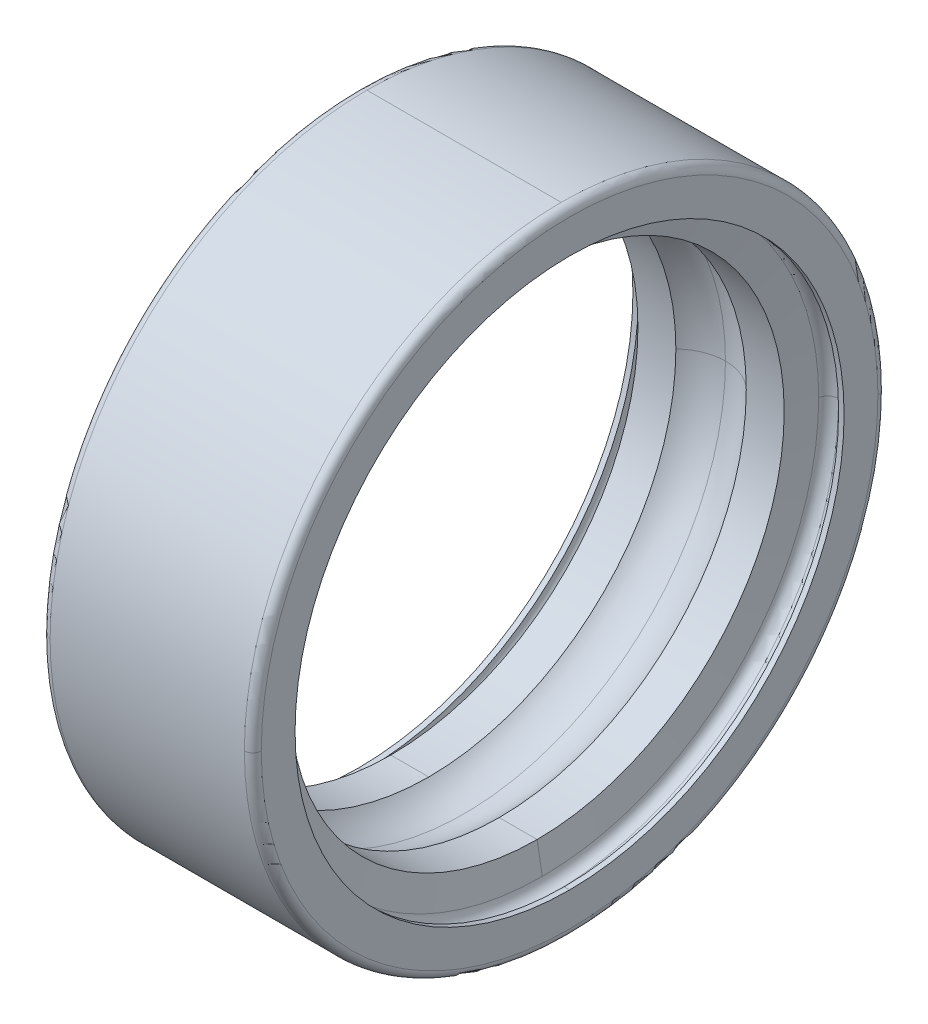
ISO-10303-21;
HEADER;
FILE_DESCRIPTION(('STEP AP214'),'2;1');
FILE_NAME('part.step','',(''),(''),'','','');
FILE_SCHEMA(('AUTOMOTIVE_DESIGN { 1 0 10303 214 1 1 1 1 }'));
ENDSEC;
DATA;
#1=APPLICATION_CONTEXT('core data for automotive mechanical design processes');
#2=APPLICATION_PROTOCOL_DEFINITION('international standard','automotive_design',2000,#1);
#3=PRODUCT_CONTEXT('',#1,'mechanical');
#4=PRODUCT('Part','Part','',(#3));
#5=PRODUCT_RELATED_PRODUCT_CATEGORY('part','',(#4));
#6=PRODUCT_DEFINITION_FORMATION('','',#4);
#7=PRODUCT_DEFINITION_CONTEXT('part definition',#1,'design');
#8=PRODUCT_DEFINITION('design','',#6,#7);
#9=PRODUCT_DEFINITION_SHAPE('','',#8);
#10=(LENGTH_UNIT() NAMED_UNIT(*) SI_UNIT(.MILLI.,.METRE.));
#11=(NAMED_UNIT(*) PLANE_ANGLE_UNIT() SI_UNIT($,.RADIAN.));
#12=(NAMED_UNIT(*) SI_UNIT($,.STERADIAN.) SOLID_ANGLE_UNIT());
#13=UNCERTAINTY_MEASURE_WITH_UNIT(LENGTH_MEASURE(1.E-05),#10,'distance_accuracy_value','');
#14=(GEOMETRIC_REPRESENTATION_CONTEXT(3) GLOBAL_UNCERTAINTY_ASSIGNED_CONTEXT((#13)) GLOBAL_UNIT_ASSIGNED_CONTEXT((#10,
#11,#12)) REPRESENTATION_CONTEXT('',''));
#15=CARTESIAN_POINT('',(0.,0.,0.));
#16=DIRECTION('',(0.,0.,1.));
#17=DIRECTION('',(1.,0.,0.));
#18=AXIS2_PLACEMENT_3D('',#15,#16,#17);
#19=CARTESIAN_POINT('',(4.61,0.,0.));
#20=DIRECTION('',(1.,0.,0.));
#21=DIRECTION('',(0.,0.,-1.));
#22=AXIS2_PLACEMENT_3D('',#19,#20,#21);
#23=TOROIDAL_SURFACE('',#22,6.5,0.26);
#24=CARTESIAN_POINT('',(4.61,0.,0.));
#25=DIRECTION('',(1.,0.,0.));
#26=DIRECTION('',(0.,0.,1.));
#27=AXIS2_PLACEMENT_3D('',#24,#25,#26);
#28=CIRCLE('',#27,6.76);
#29=CARTESIAN_POINT('',(4.61,0.,-6.76));
#30=VERTEX_POINT('',#29);
#31=CARTESIAN_POINT('',(4.61,0.,6.76));
#32=VERTEX_POINT('',#31);
#33=EDGE_CURVE('E184',#30,#32,#28,.T.);
#34=ORIENTED_EDGE('',*,*,#33,.T.);
#35=CARTESIAN_POINT('',(4.61,0.,6.5));
#36=DIRECTION('',(0.,-1.,0.));
#37=DIRECTION('',(0.,0.,1.));
#38=AXIS2_PLACEMENT_3D('',#35,#36,#37);
#39=CIRCLE('',#38,0.26);
#40=CARTESIAN_POINT('',(4.35394998421683,0.,6.5451485261934));
#41=VERTEX_POINT('',#40);
#42=EDGE_CURVE('E197',#32,#41,#39,.T.);
#43=ORIENTED_EDGE('',*,*,#42,.T.);
#44=CARTESIAN_POINT('',(4.35394998421683,0.,0.));
#45=DIRECTION('',(1.,0.,0.));
#46=DIRECTION('',(0.,1.,0.));
#47=AXIS2_PLACEMENT_3D('',#44,#45,#46);
#48=CIRCLE('',#47,6.5451485261934);
#49=CARTESIAN_POINT('',(4.35394998421683,6.5451485261934,0.));
#50=VERTEX_POINT('',#49);
#51=EDGE_CURVE('E31',#50,#41,#48,.T.);
#52=ORIENTED_EDGE('',*,*,#51,.F.);
#53=CARTESIAN_POINT('',(4.35394998421683,0.,0.));
#54=DIRECTION('',(1.,0.,0.));
#55=DIRECTION('',(0.,1.,0.));
#56=AXIS2_PLACEMENT_3D('',#53,#54,#55);
#57=CIRCLE('',#56,6.5451485261934);
#58=CARTESIAN_POINT('',(4.35394998421683,0.,-6.5451485261934));
#59=VERTEX_POINT('',#58);
#60=EDGE_CURVE('E185',#59,#50,#57,.T.);
#61=ORIENTED_EDGE('',*,*,#60,.F.);
#62=CARTESIAN_POINT('',(4.61,0.,-6.5));
#63=DIRECTION('',(0.,-1.,0.));
#64=DIRECTION('',(0.,0.,-1.));
#65=AXIS2_PLACEMENT_3D('',#62,#63,#64);
#66=CIRCLE('',#65,0.26);
#67=EDGE_CURVE('E181',#59,#30,#66,.T.);
#68=ORIENTED_EDGE('',*,*,#67,.T.);
#69=EDGE_LOOP('',(#34,#43,#52,#61,#68));
#70=FACE_BOUND('',#69,.T.);
#71=ADVANCED_FACE('F16',(#70),#23,.F.);
#72=CARTESIAN_POINT('',(4.935,0.,0.));
#73=DIRECTION('',(1.,0.,0.));
#74=DIRECTION('',(0.,1.,0.));
#75=AXIS2_PLACEMENT_3D('',#72,#73,#74);
#76=CYLINDRICAL_SURFACE('',#75,6.5);
#77=DIRECTION('',(1.,0.,0.));
#78=VECTOR('',#77,1.);
#79=CARTESIAN_POINT('',(4.935,6.5,0.));
#80=LINE('',#79,#78);
#81=CARTESIAN_POINT('',(4.87,6.5,0.));
#82=VERTEX_POINT('',#81);
#83=CARTESIAN_POINT('',(5.,6.5,0.));
#84=VERTEX_POINT('',#83);
#85=EDGE_CURVE('E323',#82,#84,#80,.T.);
#86=ORIENTED_EDGE('',*,*,#85,.T.);
#87=CARTESIAN_POINT('',(5.,0.,0.));
#88=DIRECTION('',(1.,0.,0.));
#89=DIRECTION('',(0.,1.,0.));
#90=AXIS2_PLACEMENT_3D('',#87,#88,#89);
#91=CIRCLE('',#90,6.5);
#92=CARTESIAN_POINT('',(5.,-6.5,0.));
#93=VERTEX_POINT('',#92);
#94=EDGE_CURVE('E11',#84,#93,#91,.T.);
#95=ORIENTED_EDGE('',*,*,#94,.T.);
#96=DIRECTION('',(-1.,0.,0.));
#97=VECTOR('',#96,1.);
#98=CARTESIAN_POINT('',(4.935,-6.5,0.));
#99=LINE('',#98,#97);
#100=CARTESIAN_POINT('',(4.87,-6.5,0.));
#101=VERTEX_POINT('',#100);
#102=EDGE_CURVE('E331',#93,#101,#99,.T.);
#103=ORIENTED_EDGE('',*,*,#102,.T.);
#104=CARTESIAN_POINT('',(4.87,0.,0.));
#105=DIRECTION('',(1.,0.,0.));
#106=DIRECTION('',(0.,1.,0.));
#107=AXIS2_PLACEMENT_3D('',#104,#105,#106);
#108=CIRCLE('',#107,6.5);
#109=CARTESIAN_POINT('',(4.87,0.,6.5));
#110=VERTEX_POINT('',#109);
#111=EDGE_CURVE('E201',#110,#101,#108,.T.);
#112=ORIENTED_EDGE('',*,*,#111,.F.);
#113=CARTESIAN_POINT('',(4.87,0.,0.));
#114=DIRECTION('',(1.,0.,0.));
#115=DIRECTION('',(0.,1.,0.));
#116=AXIS2_PLACEMENT_3D('',#113,#114,#115);
#117=CIRCLE('',#116,6.5);
#118=EDGE_CURVE('E241',#82,#110,#117,.T.);
#119=ORIENTED_EDGE('',*,*,#118,.F.);
#120=EDGE_LOOP('',(#86,#95,#103,#112,#119));
#121=FACE_BOUND('',#120,.T.);
#122=ADVANCED_FACE('F18',(#121),#76,.F.);
#123=CARTESIAN_POINT('',(5.,6.9,0.));
#124=DIRECTION('',(1.,0.,0.));
#125=DIRECTION('',(0.,1.,0.));
#126=AXIS2_PLACEMENT_3D('',#123,#124,#125);
#127=PLANE('',#126);
#128=ORIENTED_EDGE('',*,*,#94,.F.);
#129=CARTESIAN_POINT('',(5.,0.,0.));
#130=DIRECTION('',(1.,0.,0.));
#131=DIRECTION('',(0.,1.,0.));
#132=AXIS2_PLACEMENT_3D('',#129,#130,#131);
#133=CIRCLE('',#132,6.5);
#134=EDGE_CURVE('E337',#93,#84,#133,.T.);
#135=ORIENTED_EDGE('',*,*,#134,.F.);
#136=EDGE_LOOP('',(#128,#135));
#137=FACE_BOUND('',#136,.T.);
#138=CARTESIAN_POINT('',(5.,0.,0.));
#139=DIRECTION('',(1.,0.,0.));
#140=DIRECTION('',(0.,1.,0.));
#141=AXIS2_PLACEMENT_3D('',#138,#139,#140);
#142=CIRCLE('',#141,7.3);
#143=CARTESIAN_POINT('',(5.,0.,7.3));
#144=VERTEX_POINT('',#143);
#145=CARTESIAN_POINT('',(5.,0.,-7.3));
#146=VERTEX_POINT('',#145);
#147=EDGE_CURVE('E24',#144,#146,#142,.T.);
#148=ORIENTED_EDGE('',*,*,#147,.T.);
#149=CARTESIAN_POINT('',(5.,0.,0.));
#150=DIRECTION('',(1.,0.,0.));
#151=DIRECTION('',(0.,1.,0.));
#152=AXIS2_PLACEMENT_3D('',#149,#150,#151);
#153=CIRCLE('',#152,7.3);
#154=EDGE_CURVE('E246',#146,#144,#153,.T.);
#155=ORIENTED_EDGE('',*,*,#154,.T.);
#156=EDGE_LOOP('',(#148,#155));
#157=FACE_BOUND('',#156,.T.);
#158=ADVANCED_FACE('F401',(#137,#157),#127,.T.);
#159=CARTESIAN_POINT('',(4.8,0.,0.));
#160=DIRECTION('',(1.,0.,0.));
#161=DIRECTION('',(0.,0.,-1.));
#162=AXIS2_PLACEMENT_3D('',#159,#160,#161);
#163=TOROIDAL_SURFACE('',#162,7.3,0.2);
#164=CARTESIAN_POINT('',(4.8,0.,-7.3));
#165=DIRECTION('',(0.,-1.,0.));
#166=DIRECTION('',(0.,0.,-1.));
#167=AXIS2_PLACEMENT_3D('',#164,#165,#166);
#168=CIRCLE('',#167,0.2);
#169=CARTESIAN_POINT('',(4.8,0.,-7.5));
#170=VERTEX_POINT('',#169);
#171=EDGE_CURVE('E340',#170,#146,#168,.T.);
#172=ORIENTED_EDGE('',*,*,#171,.T.);
#173=ORIENTED_EDGE('',*,*,#147,.F.);
#174=CARTESIAN_POINT('',(4.8,0.,7.3));
#175=DIRECTION('',(0.,-1.,0.));
#176=DIRECTION('',(0.,0.,1.));
#177=AXIS2_PLACEMENT_3D('',#174,#175,#176);
#178=CIRCLE('',#177,0.2);
#179=CARTESIAN_POINT('',(4.8,0.,7.5));
#180=VERTEX_POINT('',#179);
#181=EDGE_CURVE('E253',#144,#180,#178,.T.);
#182=ORIENTED_EDGE('',*,*,#181,.T.);
#183=CARTESIAN_POINT('',(4.8,0.,0.));
#184=DIRECTION('',(1.,0.,0.));
#185=DIRECTION('',(0.,1.,0.));
#186=AXIS2_PLACEMENT_3D('',#183,#184,#185);
#187=CIRCLE('',#186,7.5);
#188=CARTESIAN_POINT('',(4.8,-7.5,0.));
#189=VERTEX_POINT('',#188);
#190=EDGE_CURVE('E303',#180,#189,#187,.T.);
#191=ORIENTED_EDGE('',*,*,#190,.T.);
#192=CARTESIAN_POINT('',(4.8,0.,0.));
#193=DIRECTION('',(1.,0.,0.));
#194=DIRECTION('',(0.,1.,0.));
#195=AXIS2_PLACEMENT_3D('',#192,#193,#194);
#196=CIRCLE('',#195,7.5);
#197=EDGE_CURVE('E398',#189,#170,#196,.T.);
#198=ORIENTED_EDGE('',*,*,#197,.T.);
#199=EDGE_LOOP('',(#172,#173,#182,#191,#198));
#200=FACE_BOUND('',#199,.T.);
#201=ADVANCED_FACE('F407',(#200),#163,.T.);
#202=CARTESIAN_POINT('',(2.5,0.,0.));
#203=DIRECTION('',(1.,0.,0.));
#204=DIRECTION('',(0.,1.,0.));
#205=AXIS2_PLACEMENT_3D('',#202,#203,#204);
#206=CYLINDRICAL_SURFACE('',#205,7.5);
#207=DIRECTION('',(1.,0.,0.));
#208=VECTOR('',#207,1.);
#209=CARTESIAN_POINT('',(2.5,7.5,0.));
#210=LINE('',#209,#208);
#211=CARTESIAN_POINT('',(0.2,7.5,0.));
#212=VERTEX_POINT('',#211);
#213=CARTESIAN_POINT('',(4.8,7.5,0.));
#214=VERTEX_POINT('',#213);
#215=EDGE_CURVE('E239',#212,#214,#210,.T.);
#216=ORIENTED_EDGE('',*,*,#215,.T.);
#217=CARTESIAN_POINT('',(4.8,0.,0.));
#218=DIRECTION('',(1.,0.,0.));
#219=DIRECTION('',(0.,1.,0.));
#220=AXIS2_PLACEMENT_3D('',#217,#218,#219);
#221=CIRCLE('',#220,7.5);
#222=EDGE_CURVE('E343',#170,#214,#221,.T.);
#223=ORIENTED_EDGE('',*,*,#222,.F.);
#224=ORIENTED_EDGE('',*,*,#197,.F.);
#225=DIRECTION('',(-1.,0.,0.));
#226=VECTOR('',#225,1.);
#227=CARTESIAN_POINT('',(2.5,-7.5,0.));
#228=LINE('',#227,#226);
#229=CARTESIAN_POINT('',(0.2,-7.5,0.));
#230=VERTEX_POINT('',#229);
#231=EDGE_CURVE('E283',#189,#230,#228,.T.);
#232=ORIENTED_EDGE('',*,*,#231,.T.);
#233=CARTESIAN_POINT('',(0.2,0.,0.));
#234=DIRECTION('',(1.,0.,0.));
#235=DIRECTION('',(0.,1.,0.));
#236=AXIS2_PLACEMENT_3D('',#233,#234,#235);
#237=CIRCLE('',#236,7.5);
#238=CARTESIAN_POINT('',(0.2,0.,-7.5));
#239=VERTEX_POINT('',#238);
#240=EDGE_CURVE('E366',#230,#239,#237,.T.);
#241=ORIENTED_EDGE('',*,*,#240,.T.);
#242=CARTESIAN_POINT('',(0.2,0.,0.));
#243=DIRECTION('',(1.,0.,0.));
#244=DIRECTION('',(0.,1.,0.));
#245=AXIS2_PLACEMENT_3D('',#242,#243,#244);
#246=CIRCLE('',#245,7.5);
#247=EDGE_CURVE('E327',#239,#212,#246,.T.);
#248=ORIENTED_EDGE('',*,*,#247,.T.);
#249=EDGE_LOOP('',(#216,#223,#224,#232,#241,#248));
#250=FACE_BOUND('',#249,.T.);
#251=ADVANCED_FACE('F411',(#250),#206,.T.);
#252=CARTESIAN_POINT('',(0.2,0.,0.));
#253=DIRECTION('',(1.,0.,0.));
#254=DIRECTION('',(0.,0.,-1.));
#255=AXIS2_PLACEMENT_3D('',#252,#253,#254);
#256=TOROIDAL_SURFACE('',#255,7.3,0.2);
#257=CARTESIAN_POINT('',(0.2,0.,-7.3));
#258=DIRECTION('',(0.,-1.,0.));
#259=DIRECTION('',(0.,0.,-1.));
#260=AXIS2_PLACEMENT_3D('',#257,#258,#259);
#261=CIRCLE('',#260,0.2);
#262=CARTESIAN_POINT('',(0.,0.,-7.3));
#263=VERTEX_POINT('',#262);
#264=EDGE_CURVE('E220',#263,#239,#261,.T.);
#265=ORIENTED_EDGE('',*,*,#264,.T.);
#266=ORIENTED_EDGE('',*,*,#240,.F.);
#267=CARTESIAN_POINT('',(0.2,0.,0.));
#268=DIRECTION('',(1.,0.,0.));
#269=DIRECTION('',(0.,1.,0.));
#270=AXIS2_PLACEMENT_3D('',#267,#268,#269);
#271=CIRCLE('',#270,7.5);
#272=CARTESIAN_POINT('',(0.2,0.,7.5));
#273=VERTEX_POINT('',#272);
#274=EDGE_CURVE('E238',#273,#230,#271,.T.);
#275=ORIENTED_EDGE('',*,*,#274,.F.);
#276=CARTESIAN_POINT('',(0.2,0.,7.3));
#277=DIRECTION('',(0.,-1.,0.));
#278=DIRECTION('',(0.,0.,1.));
#279=AXIS2_PLACEMENT_3D('',#276,#277,#278);
#280=CIRCLE('',#279,0.2);
#281=CARTESIAN_POINT('',(0.,0.,7.3));
#282=VERTEX_POINT('',#281);
#283=EDGE_CURVE('E324',#273,#282,#280,.T.);
#284=ORIENTED_EDGE('',*,*,#283,.T.);
#285=CARTESIAN_POINT('',(0.,0.,0.));
#286=DIRECTION('',(1.,0.,0.));
#287=DIRECTION('',(0.,1.,0.));
#288=AXIS2_PLACEMENT_3D('',#285,#286,#287);
#289=CIRCLE('',#288,7.3);
#290=EDGE_CURVE('E361',#282,#263,#289,.T.);
#291=ORIENTED_EDGE('',*,*,#290,.T.);
#292=EDGE_LOOP('',(#265,#266,#275,#284,#291));
#293=FACE_BOUND('',#292,.T.);
#294=ADVANCED_FACE('F424',(#293),#256,.T.);
#295=CARTESIAN_POINT('',(0.,6.9,0.));
#296=DIRECTION('',(-1.,0.,0.));
#297=DIRECTION('',(0.,0.,1.));
#298=AXIS2_PLACEMENT_3D('',#295,#296,#297);
#299=PLANE('',#298);
#300=CARTESIAN_POINT('',(0.,0.,0.));
#301=DIRECTION('',(1.,0.,0.));
#302=DIRECTION('',(0.,1.,0.));
#303=AXIS2_PLACEMENT_3D('',#300,#301,#302);
#304=CIRCLE('',#303,6.5);
#305=CARTESIAN_POINT('',(0.,6.5,0.));
#306=VERTEX_POINT('',#305);
#307=CARTESIAN_POINT('',(0.,-6.5,0.));
#308=VERTEX_POINT('',#307);
#309=EDGE_CURVE('E357',#306,#308,#304,.T.);
#310=ORIENTED_EDGE('',*,*,#309,.T.);
#311=CARTESIAN_POINT('',(0.,0.,0.));
#312=DIRECTION('',(1.,0.,0.));
#313=DIRECTION('',(0.,1.,0.));
#314=AXIS2_PLACEMENT_3D('',#311,#312,#313);
#315=CIRCLE('',#314,6.5);
#316=EDGE_CURVE('E364',#308,#306,#315,.T.);
#317=ORIENTED_EDGE('',*,*,#316,.T.);
#318=EDGE_LOOP('',(#310,#317));
#319=FACE_BOUND('',#318,.T.);
#320=CARTESIAN_POINT('',(0.,0.,0.));
#321=DIRECTION('',(1.,0.,0.));
#322=DIRECTION('',(0.,1.,0.));
#323=AXIS2_PLACEMENT_3D('',#320,#321,#322);
#324=CIRCLE('',#323,7.3);
#325=EDGE_CURVE('E328',#263,#282,#324,.T.);
#326=ORIENTED_EDGE('',*,*,#325,.F.);
#327=ORIENTED_EDGE('',*,*,#290,.F.);
#328=EDGE_LOOP('',(#326,#327));
#329=FACE_BOUND('',#328,.T.);
#330=ADVANCED_FACE('F427',(#319,#329),#299,.T.);
#331=CARTESIAN_POINT('',(0.065,0.,0.));
#332=DIRECTION('',(1.,0.,0.));
#333=DIRECTION('',(0.,1.,0.));
#334=AXIS2_PLACEMENT_3D('',#331,#332,#333);
#335=CYLINDRICAL_SURFACE('',#334,6.5);
#336=DIRECTION('',(1.,0.,0.));
#337=VECTOR('',#336,1.);
#338=CARTESIAN_POINT('',(0.065,6.5,0.));
#339=LINE('',#338,#337);
#340=CARTESIAN_POINT('',(0.13,6.5,0.));
#341=VERTEX_POINT('',#340);
#342=EDGE_CURVE('E359',#306,#341,#339,.T.);
#343=ORIENTED_EDGE('',*,*,#342,.T.);
#344=CARTESIAN_POINT('',(0.13,0.,0.));
#345=DIRECTION('',(1.,0.,0.));
#346=DIRECTION('',(0.,1.,0.));
#347=AXIS2_PLACEMENT_3D('',#344,#345,#346);
#348=CIRCLE('',#347,6.5);
#349=CARTESIAN_POINT('',(0.13,0.,6.5));
#350=VERTEX_POINT('',#349);
#351=EDGE_CURVE('E352',#341,#350,#348,.T.);
#352=ORIENTED_EDGE('',*,*,#351,.T.);
#353=CARTESIAN_POINT('',(0.13,0.,0.));
#354=DIRECTION('',(1.,0.,0.));
#355=DIRECTION('',(0.,1.,0.));
#356=AXIS2_PLACEMENT_3D('',#353,#354,#355);
#357=CIRCLE('',#356,6.5);
#358=CARTESIAN_POINT('',(0.13,-6.5,0.));
#359=VERTEX_POINT('',#358);
#360=EDGE_CURVE('E294',#350,#359,#357,.T.);
#361=ORIENTED_EDGE('',*,*,#360,.T.);
#362=DIRECTION('',(-1.,0.,0.));
#363=VECTOR('',#362,1.);
#364=CARTESIAN_POINT('',(0.065,-6.5,0.));
#365=LINE('',#364,#363);
#366=EDGE_CURVE('E301',#359,#308,#365,.T.);
#367=ORIENTED_EDGE('',*,*,#366,.T.);
#368=ORIENTED_EDGE('',*,*,#309,.F.);
#369=EDGE_LOOP('',(#343,#352,#361,#367,#368));
#370=FACE_BOUND('',#369,.T.);
#371=ADVANCED_FACE('F429',(#370),#335,.F.);
#372=CARTESIAN_POINT('',(0.39,0.,0.));
#373=DIRECTION('',(1.,0.,0.));
#374=DIRECTION('',(0.,0.,-1.));
#375=AXIS2_PLACEMENT_3D('',#372,#373,#374);
#376=TOROIDAL_SURFACE('',#375,6.5,0.26);
#377=CARTESIAN_POINT('',(0.39,0.,0.));
#378=DIRECTION('',(1.,0.,0.));
#379=DIRECTION('',(0.,0.,1.));
#380=AXIS2_PLACEMENT_3D('',#377,#378,#379);
#381=CIRCLE('',#380,6.76);
#382=CARTESIAN_POINT('',(0.39,0.,-6.76));
#383=VERTEX_POINT('',#382);
#384=CARTESIAN_POINT('',(0.39,0.,6.76));
#385=VERTEX_POINT('',#384);
#386=EDGE_CURVE('E252',#383,#385,#381,.T.);
#387=ORIENTED_EDGE('',*,*,#386,.T.);
#388=CARTESIAN_POINT('',(0.39,0.,6.5));
#389=DIRECTION('',(0.,-1.,0.));
#390=DIRECTION('',(0.,0.,1.));
#391=AXIS2_PLACEMENT_3D('',#388,#389,#390);
#392=CIRCLE('',#391,0.26);
#393=EDGE_CURVE('E230',#385,#350,#392,.T.);
#394=ORIENTED_EDGE('',*,*,#393,.T.);
#395=ORIENTED_EDGE('',*,*,#351,.F.);
#396=CARTESIAN_POINT('',(0.13,0.,0.));
#397=DIRECTION('',(1.,0.,0.));
#398=DIRECTION('',(0.,1.,0.));
#399=AXIS2_PLACEMENT_3D('',#396,#397,#398);
#400=CIRCLE('',#399,6.5);
#401=CARTESIAN_POINT('',(0.13,0.,-6.5));
#402=VERTEX_POINT('',#401);
#403=EDGE_CURVE('E295',#402,#341,#400,.T.);
#404=ORIENTED_EDGE('',*,*,#403,.F.);
#405=CARTESIAN_POINT('',(0.39,0.,-6.5));
#406=DIRECTION('',(0.,-1.,0.));
#407=DIRECTION('',(0.,0.,-1.));
#408=AXIS2_PLACEMENT_3D('',#405,#406,#407);
#409=CIRCLE('',#408,0.26);
#410=EDGE_CURVE('E292',#402,#383,#409,.T.);
#411=ORIENTED_EDGE('',*,*,#410,.T.);
#412=EDGE_LOOP('',(#387,#394,#395,#404,#411));
#413=FACE_BOUND('',#412,.T.);
#414=ADVANCED_FACE('F437',(#413),#376,.F.);
#415=CARTESIAN_POINT('',(0.707336736166986,0.,0.));
#416=DIRECTION('',(-1.,0.,0.));
#417=DIRECTION('',(0.,1.,0.));
#418=AXIS2_PLACEMENT_3D('',#415,#416,#417);
#419=CONICAL_SURFACE('',#418,6.1975742630967,1.39626340159546);
#420=DIRECTION('',(0.17364817766693,-0.984807753012208,0.));
#421=VECTOR('',#420,1.);
#422=CARTESIAN_POINT('',(0.707336736166986,6.1975742630967,0.));
#423=LINE('',#422,#421);
#424=CARTESIAN_POINT('',(0.646050015783175,6.5451485261934,0.));
#425=VERTEX_POINT('',#424);
#426=CARTESIAN_POINT('',(0.768623456550796,5.85,0.));
#427=VERTEX_POINT('',#426);
#428=EDGE_CURVE('E227',#425,#427,#423,.T.);
#429=ORIENTED_EDGE('',*,*,#428,.T.);
#430=CARTESIAN_POINT('',(0.768623456550796,0.,0.));
#431=DIRECTION('',(1.,0.,0.));
#432=DIRECTION('',(0.,1.,0.));
#433=AXIS2_PLACEMENT_3D('',#430,#431,#432);
#434=CIRCLE('',#433,5.85);
#435=CARTESIAN_POINT('',(0.768623456550796,-5.85,0.));
#436=VERTEX_POINT('',#435);
#437=EDGE_CURVE('E350',#427,#436,#434,.T.);
#438=ORIENTED_EDGE('',*,*,#437,.T.);
#439=DIRECTION('',(-0.17364817766693,-0.984807753012208,0.));
#440=VECTOR('',#439,1.);
#441=CARTESIAN_POINT('',(0.707336736166986,-6.1975742630967,0.));
#442=LINE('',#441,#440);
#443=CARTESIAN_POINT('',(0.646050015783175,-6.5451485261934,0.));
#444=VERTEX_POINT('',#443);
#445=EDGE_CURVE('E229',#436,#444,#442,.T.);
#446=ORIENTED_EDGE('',*,*,#445,.T.);
#447=CARTESIAN_POINT('',(0.646050015783175,0.,0.));
#448=DIRECTION('',(1.,0.,0.));
#449=DIRECTION('',(0.,1.,0.));
#450=AXIS2_PLACEMENT_3D('',#447,#448,#449);
#451=CIRCLE('',#450,6.5451485261934);
#452=CARTESIAN_POINT('',(0.646050015783175,0.,6.5451485261934));
#453=VERTEX_POINT('',#452);
#454=EDGE_CURVE('E291',#453,#444,#451,.T.);
#455=ORIENTED_EDGE('',*,*,#454,.F.);
#456=CARTESIAN_POINT('',(0.646050015783175,0.,0.));
#457=DIRECTION('',(1.,0.,0.));
#458=DIRECTION('',(0.,1.,0.));
#459=AXIS2_PLACEMENT_3D('',#456,#457,#458);
#460=CIRCLE('',#459,6.5451485261934);
#461=EDGE_CURVE('E265',#425,#453,#460,.T.);
#462=ORIENTED_EDGE('',*,*,#461,.F.);
#463=EDGE_LOOP('',(#429,#438,#446,#455,#462));
#464=FACE_BOUND('',#463,.T.);
#465=ADVANCED_FACE('F477',(#464),#419,.F.);
#466=CARTESIAN_POINT('',(1.21754133285365,0.,0.));
#467=DIRECTION('',(1.,0.,0.));
#468=DIRECTION('',(0.,1.,0.));
#469=AXIS2_PLACEMENT_3D('',#466,#467,#468);
#470=CYLINDRICAL_SURFACE('',#469,5.85);
#471=DIRECTION('',(1.,0.,0.));
#472=VECTOR('',#471,1.);
#473=CARTESIAN_POINT('',(1.21754133285365,5.85,0.));
#474=LINE('',#473,#472);
#475=CARTESIAN_POINT('',(1.6664592091565,5.85,0.));
#476=VERTEX_POINT('',#475);
#477=EDGE_CURVE('E275',#427,#476,#474,.T.);
#478=ORIENTED_EDGE('',*,*,#477,.T.);
#479=CARTESIAN_POINT('',(1.6664592091565,0.,0.));
#480=DIRECTION('',(1.,0.,0.));
#481=DIRECTION('',(0.,1.,0.));
#482=AXIS2_PLACEMENT_3D('',#479,#480,#481);
#483=CIRCLE('',#482,5.85);
#484=CARTESIAN_POINT('',(1.6664592091565,0.,5.85));
#485=VERTEX_POINT('',#484);
#486=EDGE_CURVE('E353',#476,#485,#483,.T.);
#487=ORIENTED_EDGE('',*,*,#486,.T.);
#488=CARTESIAN_POINT('',(1.6664592091565,0.,0.));
#489=DIRECTION('',(1.,0.,0.));
#490=DIRECTION('',(0.,1.,0.));
#491=AXIS2_PLACEMENT_3D('',#488,#489,#490);
#492=CIRCLE('',#491,5.85);
#493=CARTESIAN_POINT('',(1.6664592091565,-5.85,0.));
#494=VERTEX_POINT('',#493);
#495=EDGE_CURVE('E383',#485,#494,#492,.T.);
#496=ORIENTED_EDGE('',*,*,#495,.T.);
#497=DIRECTION('',(-1.,0.,0.));
#498=VECTOR('',#497,1.);
#499=CARTESIAN_POINT('',(1.21754133285365,-5.85,0.));
#500=LINE('',#499,#498);
#501=EDGE_CURVE('E271',#494,#436,#500,.T.);
#502=ORIENTED_EDGE('',*,*,#501,.T.);
#503=ORIENTED_EDGE('',*,*,#437,.F.);
#504=EDGE_LOOP('',(#478,#487,#496,#502,#503));
#505=FACE_BOUND('',#504,.T.);
#506=ADVANCED_FACE('F474',(#505),#470,.F.);
#507=CARTESIAN_POINT('',(2.5,0.,0.));
#508=DIRECTION('',(1.,0.,0.));
#509=DIRECTION('',(0.,0.,-1.));
#510=AXIS2_PLACEMENT_3D('',#507,#508,#509);
#511=TOROIDAL_SURFACE('',#510,5.,1.1905);
#512=CARTESIAN_POINT('',(2.5,0.,0.));
#513=DIRECTION('',(1.,0.,0.));
#514=DIRECTION('',(0.,0.,1.));
#515=AXIS2_PLACEMENT_3D('',#512,#513,#514);
#516=CIRCLE('',#515,6.1905);
#517=CARTESIAN_POINT('',(2.5,0.,-6.1905));
#518=VERTEX_POINT('',#517);
#519=CARTESIAN_POINT('',(2.5,0.,6.1905));
#520=VERTEX_POINT('',#519);
#521=EDGE_CURVE('E250',#518,#520,#516,.T.);
#522=ORIENTED_EDGE('',*,*,#521,.T.);
#523=CARTESIAN_POINT('',(2.5,0.,5.));
#524=DIRECTION('',(0.,-1.,0.));
#525=DIRECTION('',(0.,0.,1.));
#526=AXIS2_PLACEMENT_3D('',#523,#524,#525);
#527=CIRCLE('',#526,1.1905);
#528=EDGE_CURVE('E385',#520,#485,#527,.T.);
#529=ORIENTED_EDGE('',*,*,#528,.T.);
#530=ORIENTED_EDGE('',*,*,#486,.F.);
#531=CARTESIAN_POINT('',(1.6664592091565,0.,0.));
#532=DIRECTION('',(1.,0.,0.));
#533=DIRECTION('',(0.,1.,0.));
#534=AXIS2_PLACEMENT_3D('',#531,#532,#533);
#535=CIRCLE('',#534,5.85);
#536=CARTESIAN_POINT('',(1.6664592091565,0.,-5.85));
#537=VERTEX_POINT('',#536);
#538=EDGE_CURVE('E332',#537,#476,#535,.T.);
#539=ORIENTED_EDGE('',*,*,#538,.F.);
#540=CARTESIAN_POINT('',(2.5,0.,-5.));
#541=DIRECTION('',(0.,-1.,0.));
#542=DIRECTION('',(0.,0.,-1.));
#543=AXIS2_PLACEMENT_3D('',#540,#541,#542);
#544=CIRCLE('',#543,1.1905);
#545=EDGE_CURVE('E335',#537,#518,#544,.T.);
#546=ORIENTED_EDGE('',*,*,#545,.T.);
#547=EDGE_LOOP('',(#522,#529,#530,#539,#546));
#548=FACE_BOUND('',#547,.T.);
#549=ADVANCED_FACE('F473',(#548),#511,.F.);
#550=CARTESIAN_POINT('',(3.78245866714635,0.,0.));
#551=DIRECTION('',(1.,0.,0.));
#552=DIRECTION('',(0.,1.,0.));
#553=AXIS2_PLACEMENT_3D('',#550,#551,#552);
#554=CYLINDRICAL_SURFACE('',#553,5.85);
#555=DIRECTION('',(1.,0.,0.));
#556=VECTOR('',#555,1.);
#557=CARTESIAN_POINT('',(3.78245866714635,5.85,0.));
#558=LINE('',#557,#556);
#559=CARTESIAN_POINT('',(3.3335407908435,5.85,0.));
#560=VERTEX_POINT('',#559);
#561=CARTESIAN_POINT('',(4.2313765434492,5.85,0.));
#562=VERTEX_POINT('',#561);
#563=EDGE_CURVE('E388',#560,#562,#558,.T.);
#564=ORIENTED_EDGE('',*,*,#563,.T.);
#565=CARTESIAN_POINT('',(4.2313765434492,0.,0.));
#566=DIRECTION('',(1.,0.,0.));
#567=DIRECTION('',(0.,1.,0.));
#568=AXIS2_PLACEMENT_3D('',#565,#566,#567);
#569=CIRCLE('',#568,5.85);
#570=CARTESIAN_POINT('',(4.2313765434492,-5.85,0.));
#571=VERTEX_POINT('',#570);
#572=EDGE_CURVE('E39',#562,#571,#569,.T.);
#573=ORIENTED_EDGE('',*,*,#572,.T.);
#574=DIRECTION('',(-1.,0.,0.));
#575=VECTOR('',#574,1.);
#576=CARTESIAN_POINT('',(3.78245866714635,-5.85,0.));
#577=LINE('',#576,#575);
#578=CARTESIAN_POINT('',(3.3335407908435,-5.85,0.));
#579=VERTEX_POINT('',#578);
#580=EDGE_CURVE('E390',#571,#579,#577,.T.);
#581=ORIENTED_EDGE('',*,*,#580,.T.);
#582=CARTESIAN_POINT('',(3.3335407908435,0.,0.));
#583=DIRECTION('',(1.,0.,0.));
#584=DIRECTION('',(0.,1.,0.));
#585=AXIS2_PLACEMENT_3D('',#582,#583,#584);
#586=CIRCLE('',#585,5.85);
#587=CARTESIAN_POINT('',(3.3335407908435,0.,5.85));
#588=VERTEX_POINT('',#587);
#589=EDGE_CURVE('E280',#588,#579,#586,.T.);
#590=ORIENTED_EDGE('',*,*,#589,.F.);
#591=CARTESIAN_POINT('',(3.3335407908435,0.,0.));
#592=DIRECTION('',(1.,0.,0.));
#593=DIRECTION('',(0.,1.,0.));
#594=AXIS2_PLACEMENT_3D('',#591,#592,#593);
#595=CIRCLE('',#594,5.85);
#596=EDGE_CURVE('E225',#560,#588,#595,.T.);
#597=ORIENTED_EDGE('',*,*,#596,.F.);
#598=EDGE_LOOP('',(#564,#573,#581,#590,#597));
#599=FACE_BOUND('',#598,.T.);
#600=ADVANCED_FACE('F469',(#599),#554,.F.);
#601=CARTESIAN_POINT('',(4.29266326383302,0.,0.));
#602=DIRECTION('',(1.,0.,0.));
#603=DIRECTION('',(0.,1.,0.));
#604=AXIS2_PLACEMENT_3D('',#601,#602,#603);
#605=CONICAL_SURFACE('',#604,6.1975742630967,1.39626340159547);
#606=DIRECTION('',(0.173648177666929,0.984807753012208,0.));
#607=VECTOR('',#606,1.);
#608=CARTESIAN_POINT('',(4.29266326383302,6.1975742630967,0.));
#609=LINE('',#608,#607);
#610=EDGE_CURVE('E312',#562,#50,#609,.T.);
#611=ORIENTED_EDGE('',*,*,#610,.T.);
#612=ORIENTED_EDGE('',*,*,#51,.T.);
#613=CARTESIAN_POINT('',(4.35394998421683,0.,0.));
#614=DIRECTION('',(1.,0.,0.));
#615=DIRECTION('',(0.,1.,0.));
#616=AXIS2_PLACEMENT_3D('',#613,#614,#615);
#617=CIRCLE('',#616,6.5451485261934);
#618=CARTESIAN_POINT('',(4.35394998421683,-6.5451485261934,0.));
#619=VERTEX_POINT('',#618);
#620=EDGE_CURVE('E314',#41,#619,#617,.T.);
#621=ORIENTED_EDGE('',*,*,#620,.T.);
#622=DIRECTION('',(-0.173648177666929,0.984807753012208,0.));
#623=VECTOR('',#622,1.);
#624=CARTESIAN_POINT('',(4.29266326383302,-6.1975742630967,0.));
#625=LINE('',#624,#623);
#626=EDGE_CURVE('E310',#619,#571,#625,.T.);
#627=ORIENTED_EDGE('',*,*,#626,.T.);
#628=ORIENTED_EDGE('',*,*,#572,.F.);
#629=EDGE_LOOP('',(#611,#612,#621,#627,#628));
#630=FACE_BOUND('',#629,.T.);
#631=ADVANCED_FACE('F465',(#630),#605,.F.);
#632=CARTESIAN_POINT('',(4.29266326383302,0.,0.));
#633=DIRECTION('',(1.,0.,0.));
#634=DIRECTION('',(0.,1.,0.));
#635=AXIS2_PLACEMENT_3D('',#632,#633,#634);
#636=CONICAL_SURFACE('',#635,6.1975742630967,1.39626340159547);
#637=ORIENTED_EDGE('',*,*,#610,.F.);
#638=CARTESIAN_POINT('',(4.2313765434492,0.,0.));
#639=DIRECTION('',(1.,0.,0.));
#640=DIRECTION('',(0.,1.,0.));
#641=AXIS2_PLACEMENT_3D('',#638,#639,#640);
#642=CIRCLE('',#641,5.85);
#643=EDGE_CURVE('E317',#571,#562,#642,.T.);
#644=ORIENTED_EDGE('',*,*,#643,.F.);
#645=ORIENTED_EDGE('',*,*,#626,.F.);
#646=CARTESIAN_POINT('',(4.35394998421683,0.,0.));
#647=DIRECTION('',(1.,0.,0.));
#648=DIRECTION('',(0.,1.,0.));
#649=AXIS2_PLACEMENT_3D('',#646,#647,#648);
#650=CIRCLE('',#649,6.5451485261934);
#651=EDGE_CURVE('E189',#619,#59,#650,.T.);
#652=ORIENTED_EDGE('',*,*,#651,.T.);
#653=ORIENTED_EDGE('',*,*,#60,.T.);
#654=EDGE_LOOP('',(#637,#644,#645,#652,#653));
#655=FACE_BOUND('',#654,.T.);
#656=ADVANCED_FACE('F461',(#655),#636,.F.);
#657=CARTESIAN_POINT('',(3.78245866714635,0.,0.));
#658=DIRECTION('',(1.,0.,0.));
#659=DIRECTION('',(0.,1.,0.));
#660=AXIS2_PLACEMENT_3D('',#657,#658,#659);
#661=CYLINDRICAL_SURFACE('',#660,5.85);
#662=ORIENTED_EDGE('',*,*,#563,.F.);
#663=CARTESIAN_POINT('',(3.3335407908435,0.,0.));
#664=DIRECTION('',(1.,0.,0.));
#665=DIRECTION('',(0.,1.,0.));
#666=AXIS2_PLACEMENT_3D('',#663,#664,#665);
#667=CIRCLE('',#666,5.85);
#668=CARTESIAN_POINT('',(3.3335407908435,0.,-5.85));
#669=VERTEX_POINT('',#668);
#670=EDGE_CURVE('E222',#669,#560,#667,.T.);
#671=ORIENTED_EDGE('',*,*,#670,.F.);
#672=CARTESIAN_POINT('',(3.3335407908435,0.,0.));
#673=DIRECTION('',(1.,0.,0.));
#674=DIRECTION('',(0.,1.,0.));
#675=AXIS2_PLACEMENT_3D('',#672,#673,#674);
#676=CIRCLE('',#675,5.85);
#677=EDGE_CURVE('E286',#579,#669,#676,.T.);
#678=ORIENTED_EDGE('',*,*,#677,.F.);
#679=ORIENTED_EDGE('',*,*,#580,.F.);
#680=ORIENTED_EDGE('',*,*,#643,.T.);
#681=EDGE_LOOP('',(#662,#671,#678,#679,#680));
#682=FACE_BOUND('',#681,.T.);
#683=ADVANCED_FACE('F457',(#682),#661,.F.);
#684=CARTESIAN_POINT('',(2.5,0.,0.));
#685=DIRECTION('',(1.,0.,0.));
#686=DIRECTION('',(0.,0.,-1.));
#687=AXIS2_PLACEMENT_3D('',#684,#685,#686);
#688=TOROIDAL_SURFACE('',#687,5.,1.1905);
#689=CARTESIAN_POINT('',(2.5,0.,0.));
#690=DIRECTION('',(1.,0.,0.));
#691=DIRECTION('',(0.,0.,1.));
#692=AXIS2_PLACEMENT_3D('',#689,#690,#691);
#693=CIRCLE('',#692,6.1905);
#694=EDGE_CURVE('E244',#520,#518,#693,.T.);
#695=ORIENTED_EDGE('',*,*,#694,.T.);
#696=ORIENTED_EDGE('',*,*,#545,.F.);
#697=CARTESIAN_POINT('',(1.6664592091565,0.,0.));
#698=DIRECTION('',(1.,0.,0.));
#699=DIRECTION('',(0.,1.,0.));
#700=AXIS2_PLACEMENT_3D('',#697,#698,#699);
#701=CIRCLE('',#700,5.85);
#702=EDGE_CURVE('E274',#494,#537,#701,.T.);
#703=ORIENTED_EDGE('',*,*,#702,.F.);
#704=ORIENTED_EDGE('',*,*,#495,.F.);
#705=ORIENTED_EDGE('',*,*,#528,.F.);
#706=EDGE_LOOP('',(#695,#696,#703,#704,#705));
#707=FACE_BOUND('',#706,.T.);
#708=ADVANCED_FACE('F460',(#707),#688,.F.);
#709=CARTESIAN_POINT('',(1.21754133285365,0.,0.));
#710=DIRECTION('',(1.,0.,0.));
#711=DIRECTION('',(0.,1.,0.));
#712=AXIS2_PLACEMENT_3D('',#709,#710,#711);
#713=CYLINDRICAL_SURFACE('',#712,5.85);
#714=ORIENTED_EDGE('',*,*,#477,.F.);
#715=CARTESIAN_POINT('',(0.768623456550796,0.,0.));
#716=DIRECTION('',(1.,0.,0.));
#717=DIRECTION('',(0.,1.,0.));
#718=AXIS2_PLACEMENT_3D('',#715,#716,#717);
#719=CIRCLE('',#718,5.85);
#720=EDGE_CURVE('E308',#436,#427,#719,.T.);
#721=ORIENTED_EDGE('',*,*,#720,.F.);
#722=ORIENTED_EDGE('',*,*,#501,.F.);
#723=ORIENTED_EDGE('',*,*,#702,.T.);
#724=ORIENTED_EDGE('',*,*,#538,.T.);
#725=EDGE_LOOP('',(#714,#721,#722,#723,#724));
#726=FACE_BOUND('',#725,.T.);
#727=ADVANCED_FACE('F455',(#726),#713,.F.);
#728=CARTESIAN_POINT('',(0.707336736166986,0.,0.));
#729=DIRECTION('',(-1.,0.,0.));
#730=DIRECTION('',(0.,1.,0.));
#731=AXIS2_PLACEMENT_3D('',#728,#729,#730);
#732=CONICAL_SURFACE('',#731,6.1975742630967,1.39626340159546);
#733=ORIENTED_EDGE('',*,*,#428,.F.);
#734=CARTESIAN_POINT('',(0.646050015783175,0.,0.));
#735=DIRECTION('',(1.,0.,0.));
#736=DIRECTION('',(0.,1.,0.));
#737=AXIS2_PLACEMENT_3D('',#734,#735,#736);
#738=CIRCLE('',#737,6.5451485261934);
#739=CARTESIAN_POINT('',(0.646050015783175,0.,-6.5451485261934));
#740=VERTEX_POINT('',#739);
#741=EDGE_CURVE('E262',#740,#425,#738,.T.);
#742=ORIENTED_EDGE('',*,*,#741,.F.);
#743=CARTESIAN_POINT('',(0.646050015783175,0.,0.));
#744=DIRECTION('',(1.,0.,0.));
#745=DIRECTION('',(0.,1.,0.));
#746=AXIS2_PLACEMENT_3D('',#743,#744,#745);
#747=CIRCLE('',#746,6.5451485261934);
#748=EDGE_CURVE('E202',#444,#740,#747,.T.);
#749=ORIENTED_EDGE('',*,*,#748,.F.);
#750=ORIENTED_EDGE('',*,*,#445,.F.);
#751=ORIENTED_EDGE('',*,*,#720,.T.);
#752=EDGE_LOOP('',(#733,#742,#749,#750,#751));
#753=FACE_BOUND('',#752,.T.);
#754=ADVANCED_FACE('F452',(#753),#732,.F.);
#755=CARTESIAN_POINT('',(0.39,0.,0.));
#756=DIRECTION('',(1.,0.,0.));
#757=DIRECTION('',(0.,0.,-1.));
#758=AXIS2_PLACEMENT_3D('',#755,#756,#757);
#759=TOROIDAL_SURFACE('',#758,6.5,0.26);
#760=CARTESIAN_POINT('',(0.39,0.,0.));
#761=DIRECTION('',(1.,0.,0.));
#762=DIRECTION('',(0.,0.,1.));
#763=AXIS2_PLACEMENT_3D('',#760,#761,#762);
#764=CIRCLE('',#763,6.76);
#765=EDGE_CURVE('E288',#385,#383,#764,.T.);
#766=ORIENTED_EDGE('',*,*,#765,.T.);
#767=ORIENTED_EDGE('',*,*,#410,.F.);
#768=CARTESIAN_POINT('',(0.13,0.,0.));
#769=DIRECTION('',(1.,0.,0.));
#770=DIRECTION('',(0.,1.,0.));
#771=AXIS2_PLACEMENT_3D('',#768,#769,#770);
#772=CIRCLE('',#771,6.5);
#773=EDGE_CURVE('E299',#359,#402,#772,.T.);
#774=ORIENTED_EDGE('',*,*,#773,.F.);
#775=ORIENTED_EDGE('',*,*,#360,.F.);
#776=ORIENTED_EDGE('',*,*,#393,.F.);
#777=EDGE_LOOP('',(#766,#767,#774,#775,#776));
#778=FACE_BOUND('',#777,.T.);
#779=ADVANCED_FACE('F450',(#778),#759,.F.);
#780=CARTESIAN_POINT('',(0.065,0.,0.));
#781=DIRECTION('',(1.,0.,0.));
#782=DIRECTION('',(0.,1.,0.));
#783=AXIS2_PLACEMENT_3D('',#780,#781,#782);
#784=CYLINDRICAL_SURFACE('',#783,6.5);
#785=ORIENTED_EDGE('',*,*,#342,.F.);
#786=ORIENTED_EDGE('',*,*,#316,.F.);
#787=ORIENTED_EDGE('',*,*,#366,.F.);
#788=ORIENTED_EDGE('',*,*,#773,.T.);
#789=ORIENTED_EDGE('',*,*,#403,.T.);
#790=EDGE_LOOP('',(#785,#786,#787,#788,#789));
#791=FACE_BOUND('',#790,.T.);
#792=ADVANCED_FACE('F502',(#791),#784,.F.);
#793=CARTESIAN_POINT('',(0.2,0.,0.));
#794=DIRECTION('',(1.,0.,0.));
#795=DIRECTION('',(0.,0.,-1.));
#796=AXIS2_PLACEMENT_3D('',#793,#794,#795);
#797=TOROIDAL_SURFACE('',#796,7.3,0.2);
#798=ORIENTED_EDGE('',*,*,#264,.F.);
#799=ORIENTED_EDGE('',*,*,#325,.T.);
#800=ORIENTED_EDGE('',*,*,#283,.F.);
#801=CARTESIAN_POINT('',(0.2,0.,0.));
#802=DIRECTION('',(1.,0.,0.));
#803=DIRECTION('',(0.,1.,0.));
#804=AXIS2_PLACEMENT_3D('',#801,#802,#803);
#805=CIRCLE('',#804,7.5);
#806=EDGE_CURVE('E235',#212,#273,#805,.T.);
#807=ORIENTED_EDGE('',*,*,#806,.F.);
#808=ORIENTED_EDGE('',*,*,#247,.F.);
#809=EDGE_LOOP('',(#798,#799,#800,#807,#808));
#810=FACE_BOUND('',#809,.T.);
#811=ADVANCED_FACE('F423',(#810),#797,.T.);
#812=CARTESIAN_POINT('',(2.5,0.,0.));
#813=DIRECTION('',(1.,0.,0.));
#814=DIRECTION('',(0.,1.,0.));
#815=AXIS2_PLACEMENT_3D('',#812,#813,#814);
#816=CYLINDRICAL_SURFACE('',#815,7.5);
#817=ORIENTED_EDGE('',*,*,#215,.F.);
#818=ORIENTED_EDGE('',*,*,#806,.T.);
#819=ORIENTED_EDGE('',*,*,#274,.T.);
#820=ORIENTED_EDGE('',*,*,#231,.F.);
#821=ORIENTED_EDGE('',*,*,#190,.F.);
#822=CARTESIAN_POINT('',(4.8,0.,0.));
#823=DIRECTION('',(1.,0.,0.));
#824=DIRECTION('',(0.,1.,0.));
#825=AXIS2_PLACEMENT_3D('',#822,#823,#824);
#826=CIRCLE('',#825,7.5);
#827=EDGE_CURVE('E256',#214,#180,#826,.T.);
#828=ORIENTED_EDGE('',*,*,#827,.F.);
#829=EDGE_LOOP('',(#817,#818,#819,#820,#821,#828));
#830=FACE_BOUND('',#829,.T.);
#831=ADVANCED_FACE('F415',(#830),#816,.T.);
#832=CARTESIAN_POINT('',(4.8,0.,0.));
#833=DIRECTION('',(1.,0.,0.));
#834=DIRECTION('',(0.,0.,-1.));
#835=AXIS2_PLACEMENT_3D('',#832,#833,#834);
#836=TOROIDAL_SURFACE('',#835,7.3,0.2);
#837=ORIENTED_EDGE('',*,*,#171,.F.);
#838=ORIENTED_EDGE('',*,*,#222,.T.);
#839=ORIENTED_EDGE('',*,*,#827,.T.);
#840=ORIENTED_EDGE('',*,*,#181,.F.);
#841=ORIENTED_EDGE('',*,*,#154,.F.);
#842=EDGE_LOOP('',(#837,#838,#839,#840,#841));
#843=FACE_BOUND('',#842,.T.);
#844=ADVANCED_FACE('F406',(#843),#836,.T.);
#845=CARTESIAN_POINT('',(4.935,0.,0.));
#846=DIRECTION('',(1.,0.,0.));
#847=DIRECTION('',(0.,1.,0.));
#848=AXIS2_PLACEMENT_3D('',#845,#846,#847);
#849=CYLINDRICAL_SURFACE('',#848,6.5);
#850=ORIENTED_EDGE('',*,*,#85,.F.);
#851=CARTESIAN_POINT('',(4.87,0.,0.));
#852=DIRECTION('',(1.,0.,0.));
#853=DIRECTION('',(0.,1.,0.));
#854=AXIS2_PLACEMENT_3D('',#851,#852,#853);
#855=CIRCLE('',#854,6.5);
#856=CARTESIAN_POINT('',(4.87,0.,-6.5));
#857=VERTEX_POINT('',#856);
#858=EDGE_CURVE('E212',#857,#82,#855,.T.);
#859=ORIENTED_EDGE('',*,*,#858,.F.);
#860=CARTESIAN_POINT('',(4.87,0.,0.));
#861=DIRECTION('',(1.,0.,0.));
#862=DIRECTION('',(0.,1.,0.));
#863=AXIS2_PLACEMENT_3D('',#860,#861,#862);
#864=CIRCLE('',#863,6.5);
#865=EDGE_CURVE('E190',#101,#857,#864,.T.);
#866=ORIENTED_EDGE('',*,*,#865,.F.);
#867=ORIENTED_EDGE('',*,*,#102,.F.);
#868=ORIENTED_EDGE('',*,*,#134,.T.);
#869=EDGE_LOOP('',(#850,#859,#866,#867,#868));
#870=FACE_BOUND('',#869,.T.);
#871=ADVANCED_FACE('F517',(#870),#849,.F.);
#872=CARTESIAN_POINT('',(4.61,0.,0.));
#873=DIRECTION('',(1.,0.,0.));
#874=DIRECTION('',(0.,0.,-1.));
#875=AXIS2_PLACEMENT_3D('',#872,#873,#874);
#876=TOROIDAL_SURFACE('',#875,6.5,0.26);
#877=CARTESIAN_POINT('',(4.61,0.,0.));
#878=DIRECTION('',(1.,0.,0.));
#879=DIRECTION('',(0.,0.,1.));
#880=AXIS2_PLACEMENT_3D('',#877,#878,#879);
#881=CIRCLE('',#880,6.76);
#882=EDGE_CURVE('E193',#32,#30,#881,.T.);
#883=ORIENTED_EDGE('',*,*,#882,.T.);
#884=ORIENTED_EDGE('',*,*,#67,.F.);
#885=ORIENTED_EDGE('',*,*,#651,.F.);
#886=ORIENTED_EDGE('',*,*,#620,.F.);
#887=ORIENTED_EDGE('',*,*,#42,.F.);
#888=EDGE_LOOP('',(#883,#884,#885,#886,#887));
#889=FACE_BOUND('',#888,.T.);
#890=ADVANCED_FACE('F195',(#889),#876,.F.);
#891=CARTESIAN_POINT('',(4.61,0.,0.));
#892=DIRECTION('',(1.,0.,0.));
#893=DIRECTION('',(0.,0.,-1.));
#894=AXIS2_PLACEMENT_3D('',#891,#892,#893);
#895=TOROIDAL_SURFACE('',#894,6.5,0.26);
#896=ORIENTED_EDGE('',*,*,#882,.F.);
#897=CARTESIAN_POINT('',(4.61,0.,6.5));
#898=DIRECTION('',(0.,-1.,0.));
#899=DIRECTION('',(0.,0.,1.));
#900=AXIS2_PLACEMENT_3D('',#897,#898,#899);
#901=CIRCLE('',#900,0.26);
#902=EDGE_CURVE('E216',#110,#32,#901,.T.);
#903=ORIENTED_EDGE('',*,*,#902,.F.);
#904=ORIENTED_EDGE('',*,*,#111,.T.);
#905=ORIENTED_EDGE('',*,*,#865,.T.);
#906=CARTESIAN_POINT('',(4.61,0.,-6.5));
#907=DIRECTION('',(0.,-1.,0.));
#908=DIRECTION('',(0.,0.,-1.));
#909=AXIS2_PLACEMENT_3D('',#906,#907,#908);
#910=CIRCLE('',#909,0.26);
#911=EDGE_CURVE('E205',#30,#857,#910,.T.);
#912=ORIENTED_EDGE('',*,*,#911,.F.);
#913=EDGE_LOOP('',(#896,#903,#904,#905,#912));
#914=FACE_BOUND('',#913,.T.);
#915=ADVANCED_FACE('F206',(#914),#895,.F.);
#916=CARTESIAN_POINT('',(0.39,0.,0.));
#917=DIRECTION('',(1.,0.,0.));
#918=DIRECTION('',(0.,0.,-1.));
#919=AXIS2_PLACEMENT_3D('',#916,#917,#918);
#920=TOROIDAL_SURFACE('',#919,6.5,0.26);
#921=ORIENTED_EDGE('',*,*,#765,.F.);
#922=CARTESIAN_POINT('',(0.39,0.,6.5));
#923=DIRECTION('',(0.,-1.,0.));
#924=DIRECTION('',(0.,0.,1.));
#925=AXIS2_PLACEMENT_3D('',#922,#923,#924);
#926=CIRCLE('',#925,0.26);
#927=EDGE_CURVE('E268',#453,#385,#926,.T.);
#928=ORIENTED_EDGE('',*,*,#927,.F.);
#929=ORIENTED_EDGE('',*,*,#454,.T.);
#930=ORIENTED_EDGE('',*,*,#748,.T.);
#931=CARTESIAN_POINT('',(0.39,0.,-6.5));
#932=DIRECTION('',(0.,-1.,0.));
#933=DIRECTION('',(0.,0.,-1.));
#934=AXIS2_PLACEMENT_3D('',#931,#932,#933);
#935=CIRCLE('',#934,0.26);
#936=EDGE_CURVE('E259',#383,#740,#935,.T.);
#937=ORIENTED_EDGE('',*,*,#936,.F.);
#938=EDGE_LOOP('',(#921,#928,#929,#930,#937));
#939=FACE_BOUND('',#938,.T.);
#940=ADVANCED_FACE('F495',(#939),#920,.F.);
#941=CARTESIAN_POINT('',(2.5,0.,0.));
#942=DIRECTION('',(1.,0.,0.));
#943=DIRECTION('',(0.,0.,-1.));
#944=AXIS2_PLACEMENT_3D('',#941,#942,#943);
#945=TOROIDAL_SURFACE('',#944,5.,1.1905);
#946=ORIENTED_EDGE('',*,*,#694,.F.);
#947=CARTESIAN_POINT('',(2.5,0.,5.));
#948=DIRECTION('',(0.,-1.,0.));
#949=DIRECTION('',(0.,0.,1.));
#950=AXIS2_PLACEMENT_3D('',#947,#948,#949);
#951=CIRCLE('',#950,1.1905);
#952=EDGE_CURVE('E234',#588,#520,#951,.T.);
#953=ORIENTED_EDGE('',*,*,#952,.F.);
#954=ORIENTED_EDGE('',*,*,#589,.T.);
#955=ORIENTED_EDGE('',*,*,#677,.T.);
#956=CARTESIAN_POINT('',(2.5,0.,-5.));
#957=DIRECTION('',(0.,-1.,0.));
#958=DIRECTION('',(0.,0.,-1.));
#959=AXIS2_PLACEMENT_3D('',#956,#957,#958);
#960=CIRCLE('',#959,1.1905);
#961=EDGE_CURVE('E226',#518,#669,#960,.T.);
#962=ORIENTED_EDGE('',*,*,#961,.F.);
#963=EDGE_LOOP('',(#946,#953,#954,#955,#962));
#964=FACE_BOUND('',#963,.T.);
#965=ADVANCED_FACE('F525',(#964),#945,.F.);
#966=CARTESIAN_POINT('',(2.5,0.,0.));
#967=DIRECTION('',(1.,0.,0.));
#968=DIRECTION('',(0.,0.,-1.));
#969=AXIS2_PLACEMENT_3D('',#966,#967,#968);
#970=TOROIDAL_SURFACE('',#969,5.,1.1905);
#971=ORIENTED_EDGE('',*,*,#521,.F.);
#972=ORIENTED_EDGE('',*,*,#961,.T.);
#973=ORIENTED_EDGE('',*,*,#670,.T.);
#974=ORIENTED_EDGE('',*,*,#596,.T.);
#975=ORIENTED_EDGE('',*,*,#952,.T.);
#976=EDGE_LOOP('',(#971,#972,#973,#974,#975));
#977=FACE_BOUND('',#976,.T.);
#978=ADVANCED_FACE('F528',(#977),#970,.F.);
#979=CARTESIAN_POINT('',(0.39,0.,0.));
#980=DIRECTION('',(1.,0.,0.));
#981=DIRECTION('',(0.,0.,-1.));
#982=AXIS2_PLACEMENT_3D('',#979,#980,#981);
#983=TOROIDAL_SURFACE('',#982,6.5,0.26);
#984=ORIENTED_EDGE('',*,*,#386,.F.);
#985=ORIENTED_EDGE('',*,*,#936,.T.);
#986=ORIENTED_EDGE('',*,*,#741,.T.);
#987=ORIENTED_EDGE('',*,*,#461,.T.);
#988=ORIENTED_EDGE('',*,*,#927,.T.);
#989=EDGE_LOOP('',(#984,#985,#986,#987,#988));
#990=FACE_BOUND('',#989,.T.);
#991=ADVANCED_FACE('F489',(#990),#983,.F.);
#992=CARTESIAN_POINT('',(4.61,0.,0.));
#993=DIRECTION('',(1.,0.,0.));
#994=DIRECTION('',(0.,0.,-1.));
#995=AXIS2_PLACEMENT_3D('',#992,#993,#994);
#996=TOROIDAL_SURFACE('',#995,6.5,0.26);
#997=ORIENTED_EDGE('',*,*,#33,.F.);
#998=ORIENTED_EDGE('',*,*,#911,.T.);
#999=ORIENTED_EDGE('',*,*,#858,.T.);
#1000=ORIENTED_EDGE('',*,*,#118,.T.);
#1001=ORIENTED_EDGE('',*,*,#902,.T.);
#1002=EDGE_LOOP('',(#997,#998,#999,#1000,#1001));
#1003=FACE_BOUND('',#1002,.T.);
#1004=ADVANCED_FACE('F214',(#1003),#996,.F.);
#1005=CLOSED_SHELL('',(#71,#122,#158,#201,#251,#294,#330,#371,#414,#465,#506,#549,#600,#631,
#656,#683,#708,#727,#754,#779,#792,#811,#831,#844,#871,#890,#915,#940,#965,#978,#991,#1004));
#1006=MANIFOLD_SOLID_BREP('B1',#1005);
#1007=ADVANCED_BREP_SHAPE_REPRESENTATION('',(#18,#1006),#14);
#1008=SHAPE_DEFINITION_REPRESENTATION(#9,#1007);
ENDSEC;
END-ISO-10303-21;
